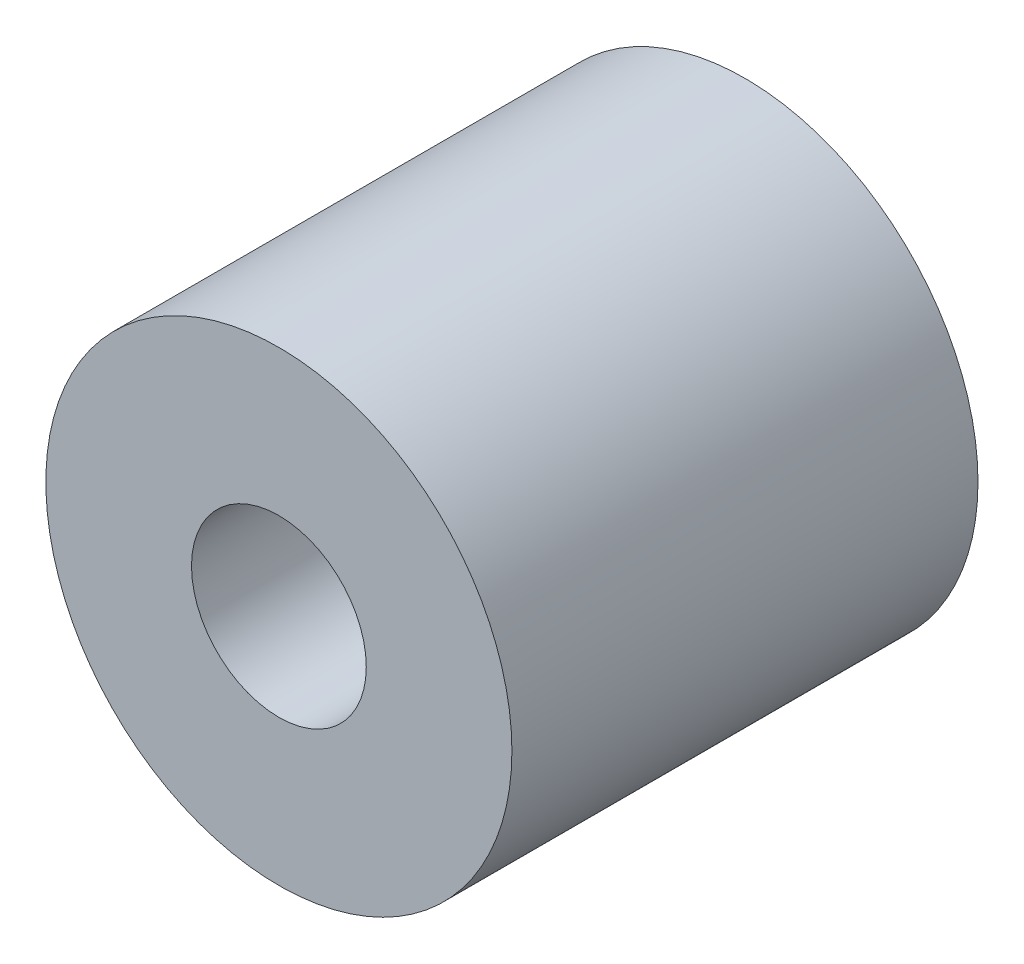
ISO-10303-21;
HEADER;
FILE_DESCRIPTION(('STEP AP214'),'2;1');
FILE_NAME('part.step','',(''),(''),'','','');
FILE_SCHEMA(('AUTOMOTIVE_DESIGN { 1 0 10303 214 1 1 1 1 }'));
ENDSEC;
DATA;
#1=APPLICATION_CONTEXT('core data for automotive mechanical design processes');
#2=APPLICATION_PROTOCOL_DEFINITION('international standard','automotive_design',2000,#1);
#3=PRODUCT_CONTEXT('',#1,'mechanical');
#4=PRODUCT('Part','Part','',(#3));
#5=PRODUCT_RELATED_PRODUCT_CATEGORY('part','',(#4));
#6=PRODUCT_DEFINITION_FORMATION('','',#4);
#7=PRODUCT_DEFINITION_CONTEXT('part definition',#1,'design');
#8=PRODUCT_DEFINITION('design','',#6,#7);
#9=PRODUCT_DEFINITION_SHAPE('','',#8);
#10=(LENGTH_UNIT() NAMED_UNIT(*) SI_UNIT(.MILLI.,.METRE.));
#11=(NAMED_UNIT(*) PLANE_ANGLE_UNIT() SI_UNIT($,.RADIAN.));
#12=(NAMED_UNIT(*) SI_UNIT($,.STERADIAN.) SOLID_ANGLE_UNIT());
#13=UNCERTAINTY_MEASURE_WITH_UNIT(LENGTH_MEASURE(1.E-05),#10,'distance_accuracy_value','');
#14=(GEOMETRIC_REPRESENTATION_CONTEXT(3) GLOBAL_UNCERTAINTY_ASSIGNED_CONTEXT((#13)) GLOBAL_UNIT_ASSIGNED_CONTEXT((#10,
#11,#12)) REPRESENTATION_CONTEXT('',''));
#15=CARTESIAN_POINT('',(0.,0.,0.));
#16=DIRECTION('',(0.,0.,1.));
#17=DIRECTION('',(1.,0.,0.));
#18=AXIS2_PLACEMENT_3D('',#15,#16,#17);
#19=CARTESIAN_POINT('',(0.,0.,25.4));
#20=DIRECTION('',(0.,0.,1.));
#21=DIRECTION('',(1.,0.,0.));
#22=AXIS2_PLACEMENT_3D('',#19,#20,#21);
#23=PLANE('',#22);
#24=CARTESIAN_POINT('',(0.,0.,25.4));
#25=DIRECTION('',(0.,0.,1.));
#26=DIRECTION('',(1.,0.,0.));
#27=AXIS2_PLACEMENT_3D('',#24,#25,#26);
#28=CIRCLE('',#27,12.7);
#29=CARTESIAN_POINT('',(12.7,0.,25.4));
#30=VERTEX_POINT('',#29);
#31=EDGE_CURVE('E10',#30,#30,#28,.T.);
#32=ORIENTED_EDGE('',*,*,#31,.T.);
#33=EDGE_LOOP('',(#32));
#34=FACE_BOUND('',#33,.T.);
#35=CARTESIAN_POINT('',(0.,0.,25.4));
#36=DIRECTION('',(0.,0.,1.));
#37=DIRECTION('',(1.,0.,0.));
#38=AXIS2_PLACEMENT_3D('',#35,#36,#37);
#39=CIRCLE('',#38,4.7625);
#40=CARTESIAN_POINT('',(4.7625,0.,25.4));
#41=VERTEX_POINT('',#40);
#42=EDGE_CURVE('E43',#41,#41,#39,.T.);
#43=ORIENTED_EDGE('',*,*,#42,.F.);
#44=EDGE_LOOP('',(#43));
#45=FACE_BOUND('',#44,.T.);
#46=ADVANCED_FACE('F32',(#34,#45),#23,.T.);
#47=CARTESIAN_POINT('',(0.,0.,0.));
#48=DIRECTION('',(0.,0.,1.));
#49=DIRECTION('',(1.,0.,0.));
#50=AXIS2_PLACEMENT_3D('',#47,#48,#49);
#51=PLANE('',#50);
#52=CARTESIAN_POINT('',(0.,0.,0.));
#53=DIRECTION('',(0.,0.,1.));
#54=DIRECTION('',(1.,0.,0.));
#55=AXIS2_PLACEMENT_3D('',#52,#53,#54);
#56=CIRCLE('',#55,12.7);
#57=CARTESIAN_POINT('',(12.7,0.,0.));
#58=VERTEX_POINT('',#57);
#59=EDGE_CURVE('E36',#58,#58,#56,.T.);
#60=ORIENTED_EDGE('',*,*,#59,.F.);
#61=EDGE_LOOP('',(#60));
#62=FACE_BOUND('',#61,.T.);
#63=CARTESIAN_POINT('',(0.,0.,0.));
#64=DIRECTION('',(0.,0.,1.));
#65=DIRECTION('',(1.,0.,0.));
#66=AXIS2_PLACEMENT_3D('',#63,#64,#65);
#67=CIRCLE('',#66,4.7625);
#68=CARTESIAN_POINT('',(4.7625,0.,0.));
#69=VERTEX_POINT('',#68);
#70=EDGE_CURVE('E45',#69,#69,#67,.T.);
#71=ORIENTED_EDGE('',*,*,#70,.T.);
#72=EDGE_LOOP('',(#71));
#73=FACE_BOUND('',#72,.T.);
#74=ADVANCED_FACE('F55',(#62,#73),#51,.F.);
#75=CARTESIAN_POINT('',(0.,0.,25.4));
#76=DIRECTION('',(0.,0.,-1.));
#77=DIRECTION('',(-1.,0.,0.));
#78=AXIS2_PLACEMENT_3D('',#75,#76,#77);
#79=CYLINDRICAL_SURFACE('',#78,12.7);
#80=ORIENTED_EDGE('',*,*,#31,.F.);
#81=EDGE_LOOP('',(#80));
#82=FACE_BOUND('',#81,.T.);
#83=ORIENTED_EDGE('',*,*,#59,.T.);
#84=EDGE_LOOP('',(#83));
#85=FACE_BOUND('',#84,.T.);
#86=ADVANCED_FACE('F34',(#82,#85),#79,.T.);
#87=CARTESIAN_POINT('',(0.,0.,25.4));
#88=DIRECTION('',(0.,0.,-1.));
#89=DIRECTION('',(-1.,0.,0.));
#90=AXIS2_PLACEMENT_3D('',#87,#88,#89);
#91=CYLINDRICAL_SURFACE('',#90,4.7625);
#92=ORIENTED_EDGE('',*,*,#42,.T.);
#93=EDGE_LOOP('',(#92));
#94=FACE_BOUND('',#93,.T.);
#95=ORIENTED_EDGE('',*,*,#70,.F.);
#96=EDGE_LOOP('',(#95));
#97=FACE_BOUND('',#96,.T.);
#98=ADVANCED_FACE('F51',(#94,#97),#91,.F.);
#99=CLOSED_SHELL('',(#46,#74,#86,#98));
#100=MANIFOLD_SOLID_BREP('B2',#99);
#101=ADVANCED_BREP_SHAPE_REPRESENTATION('',(#18,#100),#14);
#102=SHAPE_DEFINITION_REPRESENTATION(#9,#101);
ENDSEC;
END-ISO-10303-21;
